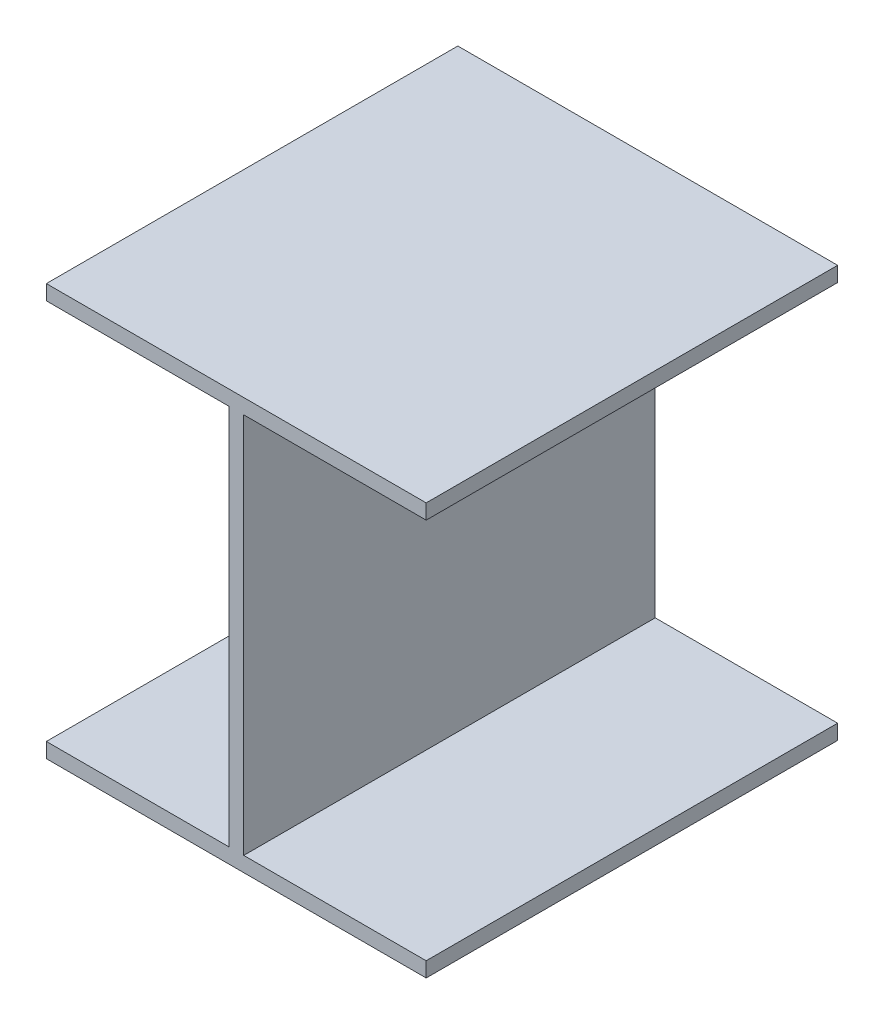
ISO-10303-21;
HEADER;
FILE_DESCRIPTION(('STEP AP214'),'2;1');
FILE_NAME('part.step','',(''),(''),'','','');
FILE_SCHEMA(('AUTOMOTIVE_DESIGN { 1 0 10303 214 1 1 1 1 }'));
ENDSEC;
DATA;
#1=APPLICATION_CONTEXT('core data for automotive mechanical design processes');
#2=APPLICATION_PROTOCOL_DEFINITION('international standard','automotive_design',2000,#1);
#3=PRODUCT_CONTEXT('',#1,'mechanical');
#4=PRODUCT('Part','Part','',(#3));
#5=PRODUCT_RELATED_PRODUCT_CATEGORY('part','',(#4));
#6=PRODUCT_DEFINITION_FORMATION('','',#4);
#7=PRODUCT_DEFINITION_CONTEXT('part definition',#1,'design');
#8=PRODUCT_DEFINITION('design','',#6,#7);
#9=PRODUCT_DEFINITION_SHAPE('','',#8);
#10=(LENGTH_UNIT() NAMED_UNIT(*) SI_UNIT(.MILLI.,.METRE.));
#11=(NAMED_UNIT(*) PLANE_ANGLE_UNIT() SI_UNIT($,.RADIAN.));
#12=(NAMED_UNIT(*) SI_UNIT($,.STERADIAN.) SOLID_ANGLE_UNIT());
#13=UNCERTAINTY_MEASURE_WITH_UNIT(LENGTH_MEASURE(1.E-05),#10,'distance_accuracy_value','');
#14=(GEOMETRIC_REPRESENTATION_CONTEXT(3) GLOBAL_UNCERTAINTY_ASSIGNED_CONTEXT((#13)) GLOBAL_UNIT_ASSIGNED_CONTEXT((#10,
#11,#12)) REPRESENTATION_CONTEXT('',''));
#15=CARTESIAN_POINT('',(0.,0.,0.));
#16=DIRECTION('',(0.,0.,1.));
#17=DIRECTION('',(1.,0.,0.));
#18=AXIS2_PLACEMENT_3D('',#15,#16,#17);
#19=CARTESIAN_POINT('',(0.,-76.55,165.1));
#20=DIRECTION('',(0.,1.,0.));
#21=DIRECTION('',(0.,0.,1.));
#22=AXIS2_PLACEMENT_3D('',#19,#20,#21);
#23=PLANE('',#22);
#24=DIRECTION('',(1.,0.,0.));
#25=VECTOR('',#24,1.);
#26=CARTESIAN_POINT('',(0.,-76.55,0.));
#27=LINE('',#26,#25);
#28=CARTESIAN_POINT('',(2.99999999999993,-76.55,0.));
#29=VERTEX_POINT('',#28);
#30=CARTESIAN_POINT('',(76.2,-76.55,0.));
#31=VERTEX_POINT('',#30);
#32=EDGE_CURVE('E150',#29,#31,#27,.T.);
#33=ORIENTED_EDGE('',*,*,#32,.F.);
#34=DIRECTION('',(0.,0.,-1.));
#35=VECTOR('',#34,1.);
#36=CARTESIAN_POINT('',(2.99999999999993,-76.55,165.1));
#37=LINE('',#36,#35);
#38=CARTESIAN_POINT('',(2.99999999999993,-76.55,165.1));
#39=VERTEX_POINT('',#38);
#40=EDGE_CURVE('E11',#39,#29,#37,.T.);
#41=ORIENTED_EDGE('',*,*,#40,.F.);
#42=DIRECTION('',(1.,0.,0.));
#43=VECTOR('',#42,1.);
#44=CARTESIAN_POINT('',(0.,-76.55,165.1));
#45=LINE('',#44,#43);
#46=CARTESIAN_POINT('',(76.2,-76.55,165.1));
#47=VERTEX_POINT('',#46);
#48=EDGE_CURVE('E179',#39,#47,#45,.T.);
#49=ORIENTED_EDGE('',*,*,#48,.T.);
#50=DIRECTION('',(0.,0.,-1.));
#51=VECTOR('',#50,1.);
#52=CARTESIAN_POINT('',(76.2,-76.55,165.1));
#53=LINE('',#52,#51);
#54=EDGE_CURVE('E98',#47,#31,#53,.T.);
#55=ORIENTED_EDGE('',*,*,#54,.T.);
#56=EDGE_LOOP('',(#33,#41,#49,#55));
#57=FACE_BOUND('',#56,.T.);
#58=ADVANCED_FACE('F35',(#57),#23,.T.);
#59=CARTESIAN_POINT('',(2.99999999999994,0.,165.1));
#60=DIRECTION('',(1.,0.,0.));
#61=DIRECTION('',(0.,1.,0.));
#62=AXIS2_PLACEMENT_3D('',#59,#60,#61);
#63=PLANE('',#62);
#64=DIRECTION('',(0.,-1.,0.));
#65=VECTOR('',#64,1.);
#66=CARTESIAN_POINT('',(2.99999999999994,0.,0.));
#67=LINE('',#66,#65);
#68=CARTESIAN_POINT('',(2.99999999999994,76.55,0.));
#69=VERTEX_POINT('',#68);
#70=EDGE_CURVE('E153',#69,#29,#67,.T.);
#71=ORIENTED_EDGE('',*,*,#70,.F.);
#72=DIRECTION('',(0.,0.,-1.));
#73=VECTOR('',#72,1.);
#74=CARTESIAN_POINT('',(2.99999999999994,76.55,165.1));
#75=LINE('',#74,#73);
#76=CARTESIAN_POINT('',(2.99999999999994,76.55,165.1));
#77=VERTEX_POINT('',#76);
#78=EDGE_CURVE('E43',#77,#69,#75,.T.);
#79=ORIENTED_EDGE('',*,*,#78,.F.);
#80=DIRECTION('',(0.,-1.,0.));
#81=VECTOR('',#80,1.);
#82=CARTESIAN_POINT('',(2.99999999999994,0.,165.1));
#83=LINE('',#82,#81);
#84=EDGE_CURVE('E210',#77,#39,#83,.T.);
#85=ORIENTED_EDGE('',*,*,#84,.T.);
#86=ORIENTED_EDGE('',*,*,#40,.T.);
#87=EDGE_LOOP('',(#71,#79,#85,#86));
#88=FACE_BOUND('',#87,.T.);
#89=ADVANCED_FACE('F209',(#88),#63,.T.);
#90=CARTESIAN_POINT('',(0.,76.55,165.1));
#91=DIRECTION('',(0.,1.,0.));
#92=DIRECTION('',(0.,0.,1.));
#93=AXIS2_PLACEMENT_3D('',#90,#91,#92);
#94=PLANE('',#93);
#95=DIRECTION('',(1.,0.,0.));
#96=VECTOR('',#95,1.);
#97=CARTESIAN_POINT('',(0.,76.55,0.));
#98=LINE('',#97,#96);
#99=CARTESIAN_POINT('',(76.2,76.55,0.));
#100=VERTEX_POINT('',#99);
#101=EDGE_CURVE('E156',#69,#100,#98,.T.);
#102=ORIENTED_EDGE('',*,*,#101,.T.);
#103=DIRECTION('',(0.,0.,-1.));
#104=VECTOR('',#103,1.);
#105=CARTESIAN_POINT('',(76.2,76.55,165.1));
#106=LINE('',#105,#104);
#107=CARTESIAN_POINT('',(76.2,76.55,165.1));
#108=VERTEX_POINT('',#107);
#109=EDGE_CURVE('E195',#108,#100,#106,.T.);
#110=ORIENTED_EDGE('',*,*,#109,.F.);
#111=DIRECTION('',(1.,0.,0.));
#112=VECTOR('',#111,1.);
#113=CARTESIAN_POINT('',(0.,76.55,165.1));
#114=LINE('',#113,#112);
#115=EDGE_CURVE('E201',#77,#108,#114,.T.);
#116=ORIENTED_EDGE('',*,*,#115,.F.);
#117=ORIENTED_EDGE('',*,*,#78,.T.);
#118=EDGE_LOOP('',(#102,#110,#116,#117));
#119=FACE_BOUND('',#118,.T.);
#120=ADVANCED_FACE('F199',(#119),#94,.F.);
#121=CARTESIAN_POINT('',(76.2,0.,165.1));
#122=DIRECTION('',(1.,0.,0.));
#123=DIRECTION('',(0.,0.,-1.));
#124=AXIS2_PLACEMENT_3D('',#121,#122,#123);
#125=PLANE('',#124);
#126=DIRECTION('',(0.,-1.,0.));
#127=VECTOR('',#126,1.);
#128=CARTESIAN_POINT('',(76.2,0.,0.));
#129=LINE('',#128,#127);
#130=CARTESIAN_POINT('',(76.2,82.55,0.));
#131=VERTEX_POINT('',#130);
#132=EDGE_CURVE('E159',#131,#100,#129,.T.);
#133=ORIENTED_EDGE('',*,*,#132,.F.);
#134=DIRECTION('',(0.,0.,-1.));
#135=VECTOR('',#134,1.);
#136=CARTESIAN_POINT('',(76.2,82.55,165.1));
#137=LINE('',#136,#135);
#138=CARTESIAN_POINT('',(76.2,82.55,165.1));
#139=VERTEX_POINT('',#138);
#140=EDGE_CURVE('E193',#139,#131,#137,.T.);
#141=ORIENTED_EDGE('',*,*,#140,.F.);
#142=DIRECTION('',(0.,-1.,0.));
#143=VECTOR('',#142,1.);
#144=CARTESIAN_POINT('',(76.2,0.,165.1));
#145=LINE('',#144,#143);
#146=EDGE_CURVE('E218',#139,#108,#145,.T.);
#147=ORIENTED_EDGE('',*,*,#146,.T.);
#148=ORIENTED_EDGE('',*,*,#109,.T.);
#149=EDGE_LOOP('',(#133,#141,#147,#148));
#150=FACE_BOUND('',#149,.T.);
#151=ADVANCED_FACE('F253',(#150),#125,.T.);
#152=CARTESIAN_POINT('',(0.,82.55,165.1));
#153=DIRECTION('',(0.,1.,0.));
#154=DIRECTION('',(0.,0.,1.));
#155=AXIS2_PLACEMENT_3D('',#152,#153,#154);
#156=PLANE('',#155);
#157=DIRECTION('',(1.,0.,0.));
#158=VECTOR('',#157,1.);
#159=CARTESIAN_POINT('',(0.,82.55,0.));
#160=LINE('',#159,#158);
#161=CARTESIAN_POINT('',(-76.2,82.55,0.));
#162=VERTEX_POINT('',#161);
#163=EDGE_CURVE('E162',#162,#131,#160,.T.);
#164=ORIENTED_EDGE('',*,*,#163,.F.);
#165=DIRECTION('',(0.,0.,-1.));
#166=VECTOR('',#165,1.);
#167=CARTESIAN_POINT('',(-76.2,82.55,165.1));
#168=LINE('',#167,#166);
#169=CARTESIAN_POINT('',(-76.2,82.55,165.1));
#170=VERTEX_POINT('',#169);
#171=EDGE_CURVE('E191',#170,#162,#168,.T.);
#172=ORIENTED_EDGE('',*,*,#171,.F.);
#173=DIRECTION('',(1.,0.,0.));
#174=VECTOR('',#173,1.);
#175=CARTESIAN_POINT('',(0.,82.55,165.1));
#176=LINE('',#175,#174);
#177=EDGE_CURVE('E221',#170,#139,#176,.T.);
#178=ORIENTED_EDGE('',*,*,#177,.T.);
#179=ORIENTED_EDGE('',*,*,#140,.T.);
#180=EDGE_LOOP('',(#164,#172,#178,#179));
#181=FACE_BOUND('',#180,.T.);
#182=ADVANCED_FACE('F250',(#181),#156,.T.);
#183=CARTESIAN_POINT('',(-76.2,0.,165.1));
#184=DIRECTION('',(1.,0.,0.));
#185=DIRECTION('',(0.,0.,-1.));
#186=AXIS2_PLACEMENT_3D('',#183,#184,#185);
#187=PLANE('',#186);
#188=DIRECTION('',(0.,-1.,0.));
#189=VECTOR('',#188,1.);
#190=CARTESIAN_POINT('',(-76.2,0.,0.));
#191=LINE('',#190,#189);
#192=CARTESIAN_POINT('',(-76.2,76.55,0.));
#193=VERTEX_POINT('',#192);
#194=EDGE_CURVE('E165',#162,#193,#191,.T.);
#195=ORIENTED_EDGE('',*,*,#194,.T.);
#196=DIRECTION('',(0.,0.,-1.));
#197=VECTOR('',#196,1.);
#198=CARTESIAN_POINT('',(-76.2,76.55,165.1));
#199=LINE('',#198,#197);
#200=CARTESIAN_POINT('',(-76.2,76.55,165.1));
#201=VERTEX_POINT('',#200);
#202=EDGE_CURVE('E188',#201,#193,#199,.T.);
#203=ORIENTED_EDGE('',*,*,#202,.F.);
#204=DIRECTION('',(0.,-1.,0.));
#205=VECTOR('',#204,1.);
#206=CARTESIAN_POINT('',(-76.2,0.,165.1));
#207=LINE('',#206,#205);
#208=EDGE_CURVE('E224',#170,#201,#207,.T.);
#209=ORIENTED_EDGE('',*,*,#208,.F.);
#210=ORIENTED_EDGE('',*,*,#171,.T.);
#211=EDGE_LOOP('',(#195,#203,#209,#210));
#212=FACE_BOUND('',#211,.T.);
#213=ADVANCED_FACE('F246',(#212),#187,.F.);
#214=CARTESIAN_POINT('',(0.,76.55,165.1));
#215=DIRECTION('',(0.,1.,0.));
#216=DIRECTION('',(0.,0.,1.));
#217=AXIS2_PLACEMENT_3D('',#214,#215,#216);
#218=PLANE('',#217);
#219=DIRECTION('',(1.,0.,0.));
#220=VECTOR('',#219,1.);
#221=CARTESIAN_POINT('',(0.,76.55,0.));
#222=LINE('',#221,#220);
#223=CARTESIAN_POINT('',(-3.00000000000006,76.55,0.));
#224=VERTEX_POINT('',#223);
#225=EDGE_CURVE('E167',#193,#224,#222,.T.);
#226=ORIENTED_EDGE('',*,*,#225,.T.);
#227=DIRECTION('',(0.,0.,-1.));
#228=VECTOR('',#227,1.);
#229=CARTESIAN_POINT('',(-3.00000000000006,76.55,165.1));
#230=LINE('',#229,#228);
#231=CARTESIAN_POINT('',(-3.00000000000006,76.55,165.1));
#232=VERTEX_POINT('',#231);
#233=EDGE_CURVE('E185',#232,#224,#230,.T.);
#234=ORIENTED_EDGE('',*,*,#233,.F.);
#235=DIRECTION('',(1.,0.,0.));
#236=VECTOR('',#235,1.);
#237=CARTESIAN_POINT('',(0.,76.55,165.1));
#238=LINE('',#237,#236);
#239=EDGE_CURVE('E226',#201,#232,#238,.T.);
#240=ORIENTED_EDGE('',*,*,#239,.F.);
#241=ORIENTED_EDGE('',*,*,#202,.T.);
#242=EDGE_LOOP('',(#226,#234,#240,#241));
#243=FACE_BOUND('',#242,.T.);
#244=ADVANCED_FACE('F242',(#243),#218,.F.);
#245=CARTESIAN_POINT('',(-3.00000000000006,0.,165.1));
#246=DIRECTION('',(1.,0.,0.));
#247=DIRECTION('',(0.,1.,0.));
#248=AXIS2_PLACEMENT_3D('',#245,#246,#247);
#249=PLANE('',#248);
#250=DIRECTION('',(0.,-1.,0.));
#251=VECTOR('',#250,1.);
#252=CARTESIAN_POINT('',(-3.00000000000006,0.,0.));
#253=LINE('',#252,#251);
#254=CARTESIAN_POINT('',(-3.00000000000006,-76.55,0.));
#255=VERTEX_POINT('',#254);
#256=EDGE_CURVE('E169',#224,#255,#253,.T.);
#257=ORIENTED_EDGE('',*,*,#256,.T.);
#258=DIRECTION('',(0.,0.,-1.));
#259=VECTOR('',#258,1.);
#260=CARTESIAN_POINT('',(-3.00000000000006,-76.55,165.1));
#261=LINE('',#260,#259);
#262=CARTESIAN_POINT('',(-3.00000000000006,-76.55,165.1));
#263=VERTEX_POINT('',#262);
#264=EDGE_CURVE('E183',#263,#255,#261,.T.);
#265=ORIENTED_EDGE('',*,*,#264,.F.);
#266=DIRECTION('',(0.,-1.,0.));
#267=VECTOR('',#266,1.);
#268=CARTESIAN_POINT('',(-3.00000000000006,0.,165.1));
#269=LINE('',#268,#267);
#270=EDGE_CURVE('E228',#232,#263,#269,.T.);
#271=ORIENTED_EDGE('',*,*,#270,.F.);
#272=ORIENTED_EDGE('',*,*,#233,.T.);
#273=EDGE_LOOP('',(#257,#265,#271,#272));
#274=FACE_BOUND('',#273,.T.);
#275=ADVANCED_FACE('F237',(#274),#249,.F.);
#276=CARTESIAN_POINT('',(0.,-76.55,165.1));
#277=DIRECTION('',(0.,1.,0.));
#278=DIRECTION('',(0.,0.,1.));
#279=AXIS2_PLACEMENT_3D('',#276,#277,#278);
#280=PLANE('',#279);
#281=DIRECTION('',(1.,0.,0.));
#282=VECTOR('',#281,1.);
#283=CARTESIAN_POINT('',(0.,-76.55,0.));
#284=LINE('',#283,#282);
#285=CARTESIAN_POINT('',(-76.2,-76.55,0.));
#286=VERTEX_POINT('',#285);
#287=EDGE_CURVE('E172',#286,#255,#284,.T.);
#288=ORIENTED_EDGE('',*,*,#287,.F.);
#289=DIRECTION('',(0.,0.,-1.));
#290=VECTOR('',#289,1.);
#291=CARTESIAN_POINT('',(-76.2,-76.55,165.1));
#292=LINE('',#291,#290);
#293=CARTESIAN_POINT('',(-76.2,-76.55,165.1));
#294=VERTEX_POINT('',#293);
#295=EDGE_CURVE('E142',#294,#286,#292,.T.);
#296=ORIENTED_EDGE('',*,*,#295,.F.);
#297=DIRECTION('',(1.,0.,0.));
#298=VECTOR('',#297,1.);
#299=CARTESIAN_POINT('',(0.,-76.55,165.1));
#300=LINE('',#299,#298);
#301=EDGE_CURVE('E135',#294,#263,#300,.T.);
#302=ORIENTED_EDGE('',*,*,#301,.T.);
#303=ORIENTED_EDGE('',*,*,#264,.T.);
#304=EDGE_LOOP('',(#288,#296,#302,#303));
#305=FACE_BOUND('',#304,.T.);
#306=ADVANCED_FACE('F231',(#305),#280,.T.);
#307=CARTESIAN_POINT('',(-76.2,0.,165.1));
#308=DIRECTION('',(1.,0.,0.));
#309=DIRECTION('',(0.,0.,-1.));
#310=AXIS2_PLACEMENT_3D('',#307,#308,#309);
#311=PLANE('',#310);
#312=DIRECTION('',(0.,-1.,0.));
#313=VECTOR('',#312,1.);
#314=CARTESIAN_POINT('',(-76.2,0.,0.));
#315=LINE('',#314,#313);
#316=CARTESIAN_POINT('',(-76.2,-82.55,0.));
#317=VERTEX_POINT('',#316);
#318=EDGE_CURVE('E141',#286,#317,#315,.T.);
#319=ORIENTED_EDGE('',*,*,#318,.T.);
#320=DIRECTION('',(0.,0.,-1.));
#321=VECTOR('',#320,1.);
#322=CARTESIAN_POINT('',(-76.2,-82.55,165.1));
#323=LINE('',#322,#321);
#324=CARTESIAN_POINT('',(-76.2,-82.55,165.1));
#325=VERTEX_POINT('',#324);
#326=EDGE_CURVE('E138',#325,#317,#323,.T.);
#327=ORIENTED_EDGE('',*,*,#326,.F.);
#328=DIRECTION('',(0.,-1.,0.));
#329=VECTOR('',#328,1.);
#330=CARTESIAN_POINT('',(-76.2,0.,165.1));
#331=LINE('',#330,#329);
#332=EDGE_CURVE('E129',#294,#325,#331,.T.);
#333=ORIENTED_EDGE('',*,*,#332,.F.);
#334=ORIENTED_EDGE('',*,*,#295,.T.);
#335=EDGE_LOOP('',(#319,#327,#333,#334));
#336=FACE_BOUND('',#335,.T.);
#337=ADVANCED_FACE('F139',(#336),#311,.F.);
#338=CARTESIAN_POINT('',(0.,-82.55,165.1));
#339=DIRECTION('',(0.,1.,0.));
#340=DIRECTION('',(0.,0.,1.));
#341=AXIS2_PLACEMENT_3D('',#338,#339,#340);
#342=PLANE('',#341);
#343=DIRECTION('',(1.,0.,0.));
#344=VECTOR('',#343,1.);
#345=CARTESIAN_POINT('',(0.,-82.55,0.));
#346=LINE('',#345,#344);
#347=CARTESIAN_POINT('',(76.2,-82.55,0.));
#348=VERTEX_POINT('',#347);
#349=EDGE_CURVE('E91',#317,#348,#346,.T.);
#350=ORIENTED_EDGE('',*,*,#349,.T.);
#351=DIRECTION('',(0.,0.,-1.));
#352=VECTOR('',#351,1.);
#353=CARTESIAN_POINT('',(76.2,-82.55,165.1));
#354=LINE('',#353,#352);
#355=CARTESIAN_POINT('',(76.2,-82.55,165.1));
#356=VERTEX_POINT('',#355);
#357=EDGE_CURVE('E143',#356,#348,#354,.T.);
#358=ORIENTED_EDGE('',*,*,#357,.F.);
#359=DIRECTION('',(1.,0.,0.));
#360=VECTOR('',#359,1.);
#361=CARTESIAN_POINT('',(0.,-82.55,165.1));
#362=LINE('',#361,#360);
#363=EDGE_CURVE('E133',#325,#356,#362,.T.);
#364=ORIENTED_EDGE('',*,*,#363,.F.);
#365=ORIENTED_EDGE('',*,*,#326,.T.);
#366=EDGE_LOOP('',(#350,#358,#364,#365));
#367=FACE_BOUND('',#366,.T.);
#368=ADVANCED_FACE('F145',(#367),#342,.F.);
#369=CARTESIAN_POINT('',(76.2,0.,165.1));
#370=DIRECTION('',(-1.,0.,0.));
#371=DIRECTION('',(0.,0.,1.));
#372=AXIS2_PLACEMENT_3D('',#369,#370,#371);
#373=PLANE('',#372);
#374=DIRECTION('',(0.,1.,0.));
#375=VECTOR('',#374,1.);
#376=CARTESIAN_POINT('',(76.2,0.,0.));
#377=LINE('',#376,#375);
#378=EDGE_CURVE('E177',#348,#31,#377,.T.);
#379=ORIENTED_EDGE('',*,*,#378,.T.);
#380=ORIENTED_EDGE('',*,*,#54,.F.);
#381=DIRECTION('',(0.,1.,0.));
#382=VECTOR('',#381,1.);
#383=CARTESIAN_POINT('',(76.2,0.,165.1));
#384=LINE('',#383,#382);
#385=EDGE_CURVE('E51',#356,#47,#384,.T.);
#386=ORIENTED_EDGE('',*,*,#385,.F.);
#387=ORIENTED_EDGE('',*,*,#357,.T.);
#388=EDGE_LOOP('',(#379,#380,#386,#387));
#389=FACE_BOUND('',#388,.T.);
#390=ADVANCED_FACE('F213',(#389),#373,.F.);
#391=CARTESIAN_POINT('',(0.,0.,165.1));
#392=DIRECTION('',(0.,0.,1.));
#393=DIRECTION('',(1.,0.,0.));
#394=AXIS2_PLACEMENT_3D('',#391,#392,#393);
#395=PLANE('',#394);
#396=ORIENTED_EDGE('',*,*,#48,.F.);
#397=ORIENTED_EDGE('',*,*,#84,.F.);
#398=ORIENTED_EDGE('',*,*,#115,.T.);
#399=ORIENTED_EDGE('',*,*,#146,.F.);
#400=ORIENTED_EDGE('',*,*,#177,.F.);
#401=ORIENTED_EDGE('',*,*,#208,.T.);
#402=ORIENTED_EDGE('',*,*,#239,.T.);
#403=ORIENTED_EDGE('',*,*,#270,.T.);
#404=ORIENTED_EDGE('',*,*,#301,.F.);
#405=ORIENTED_EDGE('',*,*,#332,.T.);
#406=ORIENTED_EDGE('',*,*,#363,.T.);
#407=ORIENTED_EDGE('',*,*,#385,.T.);
#408=EDGE_LOOP('',(#396,#397,#398,#399,#400,#401,#402,#403,#404,#405,#406,#407));
#409=FACE_BOUND('',#408,.T.);
#410=ADVANCED_FACE('F131',(#409),#395,.T.);
#411=CARTESIAN_POINT('',(0.,0.,0.));
#412=DIRECTION('',(0.,0.,1.));
#413=DIRECTION('',(1.,0.,0.));
#414=AXIS2_PLACEMENT_3D('',#411,#412,#413);
#415=PLANE('',#414);
#416=ORIENTED_EDGE('',*,*,#32,.T.);
#417=ORIENTED_EDGE('',*,*,#378,.F.);
#418=ORIENTED_EDGE('',*,*,#349,.F.);
#419=ORIENTED_EDGE('',*,*,#318,.F.);
#420=ORIENTED_EDGE('',*,*,#287,.T.);
#421=ORIENTED_EDGE('',*,*,#256,.F.);
#422=ORIENTED_EDGE('',*,*,#225,.F.);
#423=ORIENTED_EDGE('',*,*,#194,.F.);
#424=ORIENTED_EDGE('',*,*,#163,.T.);
#425=ORIENTED_EDGE('',*,*,#132,.T.);
#426=ORIENTED_EDGE('',*,*,#101,.F.);
#427=ORIENTED_EDGE('',*,*,#70,.T.);
#428=EDGE_LOOP('',(#416,#417,#418,#419,#420,#421,#422,#423,#424,#425,#426,#427));
#429=FACE_BOUND('',#428,.T.);
#430=ADVANCED_FACE('F207',(#429),#415,.F.);
#431=CLOSED_SHELL('',(#58,#89,#120,#151,#182,#213,#244,#275,#306,#337,#368,#390,#410,#430));
#432=MANIFOLD_SOLID_BREP('B2',#431);
#433=ADVANCED_BREP_SHAPE_REPRESENTATION('',(#18,#432),#14);
#434=SHAPE_DEFINITION_REPRESENTATION(#9,#433);
ENDSEC;
END-ISO-10303-21;
